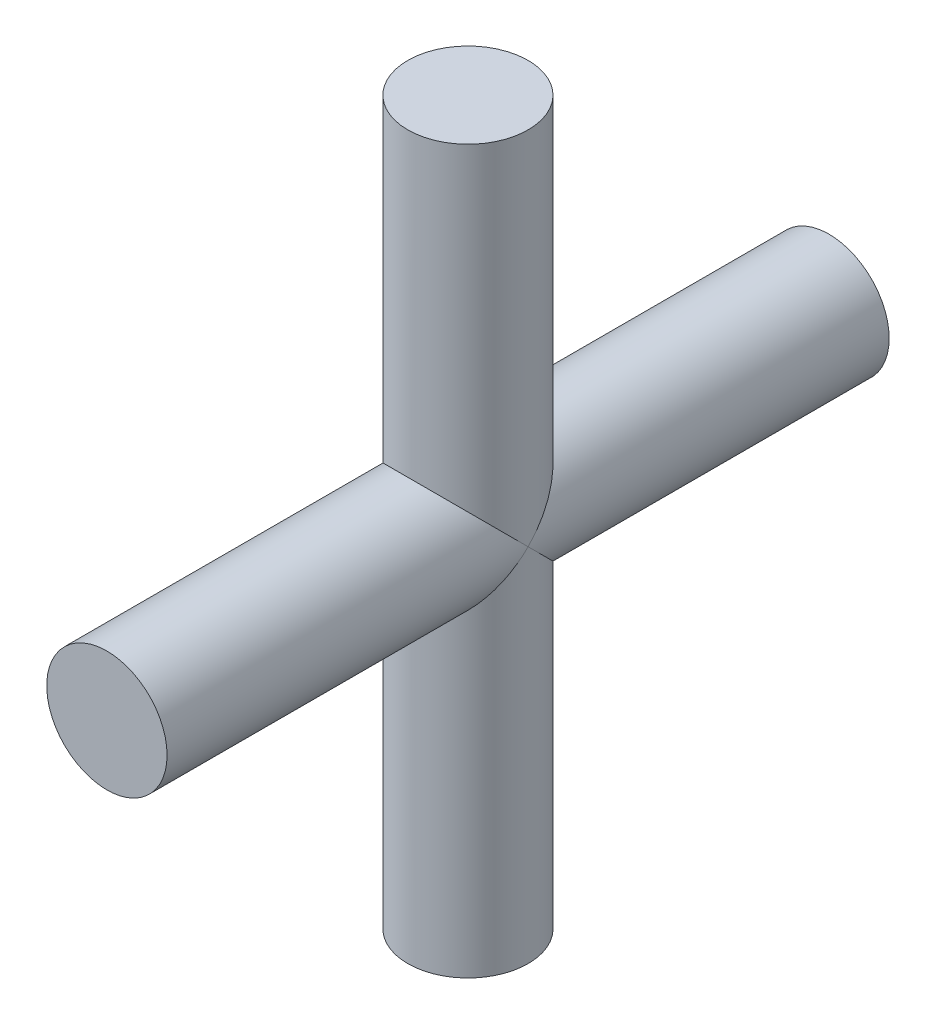
ISO-10303-21;
HEADER;
FILE_DESCRIPTION(('STEP AP214'),'2;1');
FILE_NAME('part.step','',(''),(''),'','','');
FILE_SCHEMA(('AUTOMOTIVE_DESIGN { 1 0 10303 214 1 1 1 1 }'));
ENDSEC;
DATA;
#1=APPLICATION_CONTEXT('core data for automotive mechanical design processes');
#2=APPLICATION_PROTOCOL_DEFINITION('international standard','automotive_design',2000,#1);
#3=PRODUCT_CONTEXT('',#1,'mechanical');
#4=PRODUCT('Part','Part','',(#3));
#5=PRODUCT_RELATED_PRODUCT_CATEGORY('part','',(#4));
#6=PRODUCT_DEFINITION_FORMATION('','',#4);
#7=PRODUCT_DEFINITION_CONTEXT('part definition',#1,'design');
#8=PRODUCT_DEFINITION('design','',#6,#7);
#9=PRODUCT_DEFINITION_SHAPE('','',#8);
#10=(LENGTH_UNIT() NAMED_UNIT(*) SI_UNIT(.MILLI.,.METRE.));
#11=(NAMED_UNIT(*) PLANE_ANGLE_UNIT() SI_UNIT($,.RADIAN.));
#12=(NAMED_UNIT(*) SI_UNIT($,.STERADIAN.) SOLID_ANGLE_UNIT());
#13=UNCERTAINTY_MEASURE_WITH_UNIT(LENGTH_MEASURE(1.E-05),#10,'distance_accuracy_value','');
#14=(GEOMETRIC_REPRESENTATION_CONTEXT(3) GLOBAL_UNCERTAINTY_ASSIGNED_CONTEXT((#13)) GLOBAL_UNIT_ASSIGNED_CONTEXT((#10,
#11,#12)) REPRESENTATION_CONTEXT('',''));
#15=CARTESIAN_POINT('',(0.,0.,0.));
#16=DIRECTION('',(0.,0.,1.));
#17=DIRECTION('',(1.,0.,0.));
#18=AXIS2_PLACEMENT_3D('',#15,#16,#17);
#19=CARTESIAN_POINT('',(0.,-6.096,0.));
#20=DIRECTION('',(0.,1.,0.));
#21=DIRECTION('',(0.,0.,1.));
#22=AXIS2_PLACEMENT_3D('',#19,#20,#21);
#23=CYLINDRICAL_SURFACE('',#22,1.016);
#24=CARTESIAN_POINT('',(0.,6.096,0.));
#25=DIRECTION('',(0.,1.,0.));
#26=DIRECTION('',(0.,0.,1.));
#27=AXIS2_PLACEMENT_3D('',#24,#25,#26);
#28=CIRCLE('',#27,1.016);
#29=CARTESIAN_POINT('',(0.,6.096,1.016));
#30=VERTEX_POINT('',#29);
#31=EDGE_CURVE('E69',#30,#30,#28,.T.);
#32=ORIENTED_EDGE('',*,*,#31,.F.);
#33=EDGE_LOOP('',(#32));
#34=FACE_BOUND('',#33,.T.);
#35=CARTESIAN_POINT('',(0.,0.,0.));
#36=DIRECTION('',(0.,0.707106781186547,0.707106781186548));
#37=DIRECTION('',(0.,-0.707106781186547,0.707106781186548));
#38=AXIS2_PLACEMENT_3D('',#35,#36,#37);
#39=ELLIPSE('',#38,1.43684097937106,1.016);
#40=CARTESIAN_POINT('',(-1.016,0.,0.));
#41=VERTEX_POINT('',#40);
#42=CARTESIAN_POINT('',(1.016,0.,0.));
#43=VERTEX_POINT('',#42);
#44=EDGE_CURVE('E52',#41,#43,#39,.F.);
#45=ORIENTED_EDGE('',*,*,#44,.F.);
#46=CARTESIAN_POINT('',(0.,0.,0.));
#47=DIRECTION('',(0.,0.707106781186547,-0.707106781186547));
#48=DIRECTION('',(0.,0.707106781186547,0.707106781186547));
#49=AXIS2_PLACEMENT_3D('',#46,#47,#48);
#50=ELLIPSE('',#49,1.43684097937106,1.016);
#51=EDGE_CURVE('E11',#41,#43,#50,.T.);
#52=ORIENTED_EDGE('',*,*,#51,.T.);
#53=EDGE_LOOP('',(#45,#52));
#54=FACE_BOUND('',#53,.T.);
#55=ADVANCED_FACE('F33',(#34,#54),#23,.T.);
#56=CARTESIAN_POINT('',(0.,-6.096,0.));
#57=DIRECTION('',(0.,1.,0.));
#58=DIRECTION('',(0.,0.,1.));
#59=AXIS2_PLACEMENT_3D('',#56,#57,#58);
#60=CIRCLE('',#59,1.016);
#61=CARTESIAN_POINT('',(0.,-6.096,1.016));
#62=VERTEX_POINT('',#61);
#63=EDGE_CURVE('E66',#62,#62,#60,.T.);
#64=ORIENTED_EDGE('',*,*,#63,.T.);
#65=EDGE_LOOP('',(#64));
#66=FACE_BOUND('',#65,.T.);
#67=CARTESIAN_POINT('',(0.,0.,0.));
#68=DIRECTION('',(0.,-0.707106781186547,0.707106781186548));
#69=DIRECTION('',(0.,0.707106781186547,0.707106781186548));
#70=AXIS2_PLACEMENT_3D('',#67,#68,#69);
#71=ELLIPSE('',#70,1.43684097937106,1.016);
#72=EDGE_CURVE('E56',#43,#41,#71,.F.);
#73=ORIENTED_EDGE('',*,*,#72,.F.);
#74=CARTESIAN_POINT('',(0.,0.,0.));
#75=DIRECTION('',(0.,0.707106781186547,0.707106781186547));
#76=DIRECTION('',(0.,0.707106781186547,-0.707106781186547));
#77=AXIS2_PLACEMENT_3D('',#74,#75,#76);
#78=ELLIPSE('',#77,1.43684097937106,1.016);
#79=EDGE_CURVE('E41',#43,#41,#78,.F.);
#80=ORIENTED_EDGE('',*,*,#79,.T.);
#81=EDGE_LOOP('',(#73,#80));
#82=FACE_BOUND('',#81,.T.);
#83=ADVANCED_FACE('F57',(#66,#82),#23,.T.);
#84=CARTESIAN_POINT('',(0.,-6.096,0.));
#85=DIRECTION('',(0.,1.,0.));
#86=DIRECTION('',(0.,0.,1.));
#87=AXIS2_PLACEMENT_3D('',#84,#85,#86);
#88=PLANE('',#87);
#89=ORIENTED_EDGE('',*,*,#63,.F.);
#90=EDGE_LOOP('',(#89));
#91=FACE_BOUND('',#90,.T.);
#92=ADVANCED_FACE('F93',(#91),#88,.F.);
#93=CARTESIAN_POINT('',(0.,6.096,0.));
#94=DIRECTION('',(0.,1.,0.));
#95=DIRECTION('',(0.,0.,1.));
#96=AXIS2_PLACEMENT_3D('',#93,#94,#95);
#97=PLANE('',#96);
#98=ORIENTED_EDGE('',*,*,#31,.T.);
#99=EDGE_LOOP('',(#98));
#100=FACE_BOUND('',#99,.T.);
#101=ADVANCED_FACE('F98',(#100),#97,.T.);
#102=CARTESIAN_POINT('',(0.,0.,0.));
#103=DIRECTION('',(0.,0.,1.));
#104=DIRECTION('',(1.,0.,0.));
#105=AXIS2_PLACEMENT_3D('',#102,#103,#104);
#106=CYLINDRICAL_SURFACE('',#105,1.016);
#107=ORIENTED_EDGE('',*,*,#72,.T.);
#108=ORIENTED_EDGE('',*,*,#44,.T.);
#109=EDGE_LOOP('',(#107,#108));
#110=FACE_BOUND('',#109,.T.);
#111=CARTESIAN_POINT('',(0.,0.,-6.096));
#112=DIRECTION('',(0.,0.,1.));
#113=DIRECTION('',(1.,0.,0.));
#114=AXIS2_PLACEMENT_3D('',#111,#112,#113);
#115=CIRCLE('',#114,1.016);
#116=CARTESIAN_POINT('',(1.016,0.,-6.096));
#117=VERTEX_POINT('',#116);
#118=EDGE_CURVE('E59',#117,#117,#115,.T.);
#119=ORIENTED_EDGE('',*,*,#118,.T.);
#120=EDGE_LOOP('',(#119));
#121=FACE_BOUND('',#120,.T.);
#122=ADVANCED_FACE('F35',(#110,#121),#106,.T.);
#123=CARTESIAN_POINT('',(-1.016,0.,-6.096));
#124=DIRECTION('',(0.,0.,1.));
#125=DIRECTION('',(1.,0.,0.));
#126=AXIS2_PLACEMENT_3D('',#123,#124,#125);
#127=PLANE('',#126);
#128=ORIENTED_EDGE('',*,*,#118,.F.);
#129=EDGE_LOOP('',(#128));
#130=FACE_BOUND('',#129,.T.);
#131=ADVANCED_FACE('F78',(#130),#127,.F.);
#132=CARTESIAN_POINT('',(0.,0.,6.096));
#133=DIRECTION('',(0.,0.,-1.));
#134=DIRECTION('',(-1.,0.,0.));
#135=AXIS2_PLACEMENT_3D('',#132,#133,#134);
#136=CYLINDRICAL_SURFACE('',#135,1.016);
#137=ORIENTED_EDGE('',*,*,#51,.F.);
#138=ORIENTED_EDGE('',*,*,#79,.F.);
#139=EDGE_LOOP('',(#137,#138));
#140=FACE_BOUND('',#139,.T.);
#141=CARTESIAN_POINT('',(0.,0.,6.096));
#142=DIRECTION('',(0.,0.,1.));
#143=DIRECTION('',(1.,0.,0.));
#144=AXIS2_PLACEMENT_3D('',#141,#142,#143);
#145=CIRCLE('',#144,1.016);
#146=CARTESIAN_POINT('',(1.016,0.,6.096));
#147=VERTEX_POINT('',#146);
#148=EDGE_CURVE('E72',#147,#147,#145,.T.);
#149=ORIENTED_EDGE('',*,*,#148,.F.);
#150=EDGE_LOOP('',(#149));
#151=FACE_BOUND('',#150,.T.);
#152=ADVANCED_FACE('F47',(#140,#151),#136,.T.);
#153=CARTESIAN_POINT('',(0.,0.,6.096));
#154=DIRECTION('',(0.,0.,1.));
#155=DIRECTION('',(1.,0.,0.));
#156=AXIS2_PLACEMENT_3D('',#153,#154,#155);
#157=PLANE('',#156);
#158=ORIENTED_EDGE('',*,*,#148,.T.);
#159=EDGE_LOOP('',(#158));
#160=FACE_BOUND('',#159,.T.);
#161=ADVANCED_FACE('F76',(#160),#157,.T.);
#162=CLOSED_SHELL('',(#55,#83,#92,#101,#122,#131,#152,#161));
#163=MANIFOLD_SOLID_BREP('B2',#162);
#164=ADVANCED_BREP_SHAPE_REPRESENTATION('',(#18,#163),#14);
#165=SHAPE_DEFINITION_REPRESENTATION(#9,#164);
ENDSEC;
END-ISO-10303-21;
